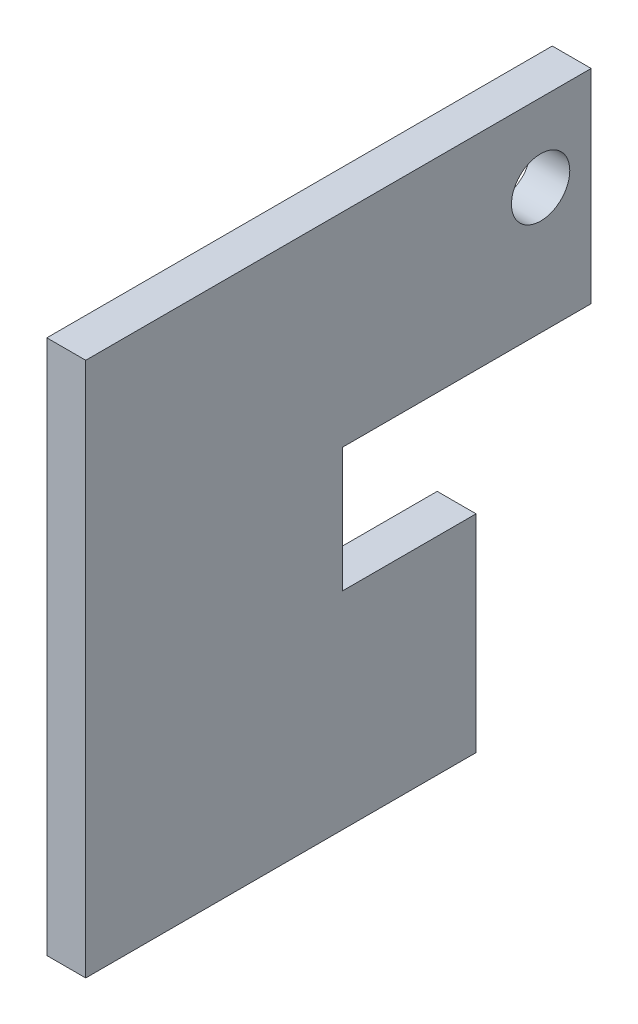
ISO-10303-21;
HEADER;
FILE_DESCRIPTION(('STEP AP214'),'2;1');
FILE_NAME('part.step','',(''),(''),'','','');
FILE_SCHEMA(('AUTOMOTIVE_DESIGN { 1 0 10303 214 1 1 1 1 }'));
ENDSEC;
DATA;
#1=APPLICATION_CONTEXT('core data for automotive mechanical design processes');
#2=APPLICATION_PROTOCOL_DEFINITION('international standard','automotive_design',2000,#1);
#3=PRODUCT_CONTEXT('',#1,'mechanical');
#4=PRODUCT('Part','Part','',(#3));
#5=PRODUCT_RELATED_PRODUCT_CATEGORY('part','',(#4));
#6=PRODUCT_DEFINITION_FORMATION('','',#4);
#7=PRODUCT_DEFINITION_CONTEXT('part definition',#1,'design');
#8=PRODUCT_DEFINITION('design','',#6,#7);
#9=PRODUCT_DEFINITION_SHAPE('','',#8);
#10=(LENGTH_UNIT() NAMED_UNIT(*) SI_UNIT(.MILLI.,.METRE.));
#11=(NAMED_UNIT(*) PLANE_ANGLE_UNIT() SI_UNIT($,.RADIAN.));
#12=(NAMED_UNIT(*) SI_UNIT($,.STERADIAN.) SOLID_ANGLE_UNIT());
#13=UNCERTAINTY_MEASURE_WITH_UNIT(LENGTH_MEASURE(1.E-05),#10,'distance_accuracy_value','');
#14=(GEOMETRIC_REPRESENTATION_CONTEXT(3) GLOBAL_UNCERTAINTY_ASSIGNED_CONTEXT((#13)) GLOBAL_UNIT_ASSIGNED_CONTEXT((#10,
#11,#12)) REPRESENTATION_CONTEXT('',''));
#15=CARTESIAN_POINT('',(0.,0.,0.));
#16=DIRECTION('',(0.,0.,1.));
#17=DIRECTION('',(1.,0.,0.));
#18=AXIS2_PLACEMENT_3D('',#15,#16,#17);
#19=CARTESIAN_POINT('',(1.27,17.4752,0.));
#20=DIRECTION('',(0.,0.,1.));
#21=DIRECTION('',(1.,0.,0.));
#22=AXIS2_PLACEMENT_3D('',#19,#20,#21);
#23=PLANE('',#22);
#24=DIRECTION('',(-1.,0.,0.));
#25=VECTOR('',#24,1.);
#26=CARTESIAN_POINT('',(1.27,10.8204,0.));
#27=LINE('',#26,#25);
#28=CARTESIAN_POINT('',(1.27,10.8204,0.));
#29=VERTEX_POINT('',#28);
#30=CARTESIAN_POINT('',(0.,10.8204,0.));
#31=VERTEX_POINT('',#30);
#32=EDGE_CURVE('E124',#29,#31,#27,.T.);
#33=ORIENTED_EDGE('',*,*,#32,.T.);
#34=DIRECTION('',(0.,1.,0.));
#35=VECTOR('',#34,1.);
#36=CARTESIAN_POINT('',(0.,17.4752,0.));
#37=LINE('',#36,#35);
#38=CARTESIAN_POINT('',(0.,17.4752,0.));
#39=VERTEX_POINT('',#38);
#40=EDGE_CURVE('E162',#31,#39,#37,.T.);
#41=ORIENTED_EDGE('',*,*,#40,.T.);
#42=DIRECTION('',(-1.,0.,0.));
#43=VECTOR('',#42,1.);
#44=CARTESIAN_POINT('',(1.27,17.4752,0.));
#45=LINE('',#44,#43);
#46=CARTESIAN_POINT('',(1.27,17.4752,0.));
#47=VERTEX_POINT('',#46);
#48=EDGE_CURVE('E42',#47,#39,#45,.T.);
#49=ORIENTED_EDGE('',*,*,#48,.F.);
#50=DIRECTION('',(0.,1.,0.));
#51=VECTOR('',#50,1.);
#52=CARTESIAN_POINT('',(1.27,17.4752,0.));
#53=LINE('',#52,#51);
#54=EDGE_CURVE('E152',#29,#47,#53,.T.);
#55=ORIENTED_EDGE('',*,*,#54,.F.);
#56=EDGE_LOOP('',(#33,#41,#49,#55));
#57=FACE_BOUND('',#56,.T.);
#58=ADVANCED_FACE('F34',(#57),#23,.F.);
#59=CARTESIAN_POINT('',(1.27,0.,0.));
#60=DIRECTION('',(1.,0.,0.));
#61=DIRECTION('',(0.,0.,-1.));
#62=AXIS2_PLACEMENT_3D('',#59,#60,#61);
#63=PLANE('',#62);
#64=DIRECTION('',(0.,-1.,0.));
#65=VECTOR('',#64,1.);
#66=CARTESIAN_POINT('',(1.27,10.8204,8.128));
#67=LINE('',#66,#65);
#68=CARTESIAN_POINT('',(1.27,10.8204,8.128));
#69=VERTEX_POINT('',#68);
#70=CARTESIAN_POINT('',(1.27,6.7564,8.128));
#71=VERTEX_POINT('',#70);
#72=EDGE_CURVE('E107',#69,#71,#67,.T.);
#73=ORIENTED_EDGE('',*,*,#72,.F.);
#74=DIRECTION('',(0.,0.,-1.));
#75=VECTOR('',#74,1.);
#76=CARTESIAN_POINT('',(1.27,10.8204,3.7592));
#77=LINE('',#76,#75);
#78=EDGE_CURVE('E137',#69,#29,#77,.T.);
#79=ORIENTED_EDGE('',*,*,#78,.T.);
#80=ORIENTED_EDGE('',*,*,#54,.T.);
#81=DIRECTION('',(0.,0.,1.));
#82=VECTOR('',#81,1.);
#83=CARTESIAN_POINT('',(1.27,17.4752,16.51));
#84=LINE('',#83,#82);
#85=CARTESIAN_POINT('',(1.27,17.4752,16.51));
#86=VERTEX_POINT('',#85);
#87=EDGE_CURVE('E154',#47,#86,#84,.T.);
#88=ORIENTED_EDGE('',*,*,#87,.T.);
#89=DIRECTION('',(0.,-1.,0.));
#90=VECTOR('',#89,1.);
#91=CARTESIAN_POINT('',(1.27,17.4752,16.51));
#92=LINE('',#91,#90);
#93=CARTESIAN_POINT('',(1.27,0.,16.51));
#94=VERTEX_POINT('',#93);
#95=EDGE_CURVE('E146',#86,#94,#92,.T.);
#96=ORIENTED_EDGE('',*,*,#95,.T.);
#97=DIRECTION('',(0.,0.,-1.));
#98=VECTOR('',#97,1.);
#99=CARTESIAN_POINT('',(1.27,0.,16.51));
#100=LINE('',#99,#98);
#101=CARTESIAN_POINT('',(1.27,0.,3.7592));
#102=VERTEX_POINT('',#101);
#103=EDGE_CURVE('E149',#94,#102,#100,.T.);
#104=ORIENTED_EDGE('',*,*,#103,.T.);
#105=DIRECTION('',(0.,1.,0.));
#106=VECTOR('',#105,1.);
#107=CARTESIAN_POINT('',(1.27,0.,3.7592));
#108=LINE('',#107,#106);
#109=CARTESIAN_POINT('',(1.27,6.7564,3.7592));
#110=VERTEX_POINT('',#109);
#111=EDGE_CURVE('E122',#102,#110,#108,.T.);
#112=ORIENTED_EDGE('',*,*,#111,.T.);
#113=DIRECTION('',(0.,0.,-1.));
#114=VECTOR('',#113,1.);
#115=CARTESIAN_POINT('',(1.27,6.7564,8.128));
#116=LINE('',#115,#114);
#117=EDGE_CURVE('E49',#71,#110,#116,.T.);
#118=ORIENTED_EDGE('',*,*,#117,.F.);
#119=EDGE_LOOP('',(#73,#79,#80,#88,#96,#104,#112,#118));
#120=FACE_BOUND('',#119,.T.);
#121=CARTESIAN_POINT('',(1.27,14.9352,1.651));
#122=DIRECTION('',(1.,0.,0.));
#123=DIRECTION('',(0.,0.,-1.));
#124=AXIS2_PLACEMENT_3D('',#121,#122,#123);
#125=CIRCLE('',#124,0.9525);
#126=CARTESIAN_POINT('',(1.27,14.9352,0.6985));
#127=VERTEX_POINT('',#126);
#128=EDGE_CURVE('E139',#127,#127,#125,.T.);
#129=ORIENTED_EDGE('',*,*,#128,.F.);
#130=EDGE_LOOP('',(#129));
#131=FACE_BOUND('',#130,.T.);
#132=ADVANCED_FACE('F119',(#120,#131),#63,.T.);
#133=CARTESIAN_POINT('',(0.,0.,0.));
#134=DIRECTION('',(1.,0.,0.));
#135=DIRECTION('',(0.,0.,-1.));
#136=AXIS2_PLACEMENT_3D('',#133,#134,#135);
#137=PLANE('',#136);
#138=DIRECTION('',(0.,0.,-1.));
#139=VECTOR('',#138,1.);
#140=CARTESIAN_POINT('',(0.,10.8204,3.7592));
#141=LINE('',#140,#139);
#142=CARTESIAN_POINT('',(0.,10.8204,8.128));
#143=VERTEX_POINT('',#142);
#144=EDGE_CURVE('E133',#143,#31,#141,.T.);
#145=ORIENTED_EDGE('',*,*,#144,.F.);
#146=DIRECTION('',(0.,1.,0.));
#147=VECTOR('',#146,1.);
#148=CARTESIAN_POINT('',(0.,10.8204,8.128));
#149=LINE('',#148,#147);
#150=CARTESIAN_POINT('',(0.,6.7564,8.128));
#151=VERTEX_POINT('',#150);
#152=EDGE_CURVE('E106',#151,#143,#149,.T.);
#153=ORIENTED_EDGE('',*,*,#152,.F.);
#154=DIRECTION('',(0.,0.,-1.));
#155=VECTOR('',#154,1.);
#156=CARTESIAN_POINT('',(0.,6.7564,8.128));
#157=LINE('',#156,#155);
#158=CARTESIAN_POINT('',(0.,6.7564,3.7592));
#159=VERTEX_POINT('',#158);
#160=EDGE_CURVE('E102',#151,#159,#157,.T.);
#161=ORIENTED_EDGE('',*,*,#160,.T.);
#162=DIRECTION('',(0.,1.,0.));
#163=VECTOR('',#162,1.);
#164=CARTESIAN_POINT('',(0.,0.,3.7592));
#165=LINE('',#164,#163);
#166=CARTESIAN_POINT('',(0.,0.,3.7592));
#167=VERTEX_POINT('',#166);
#168=EDGE_CURVE('E130',#167,#159,#165,.T.);
#169=ORIENTED_EDGE('',*,*,#168,.F.);
#170=DIRECTION('',(0.,0.,-1.));
#171=VECTOR('',#170,1.);
#172=CARTESIAN_POINT('',(0.,0.,16.51));
#173=LINE('',#172,#171);
#174=CARTESIAN_POINT('',(0.,0.,16.51));
#175=VERTEX_POINT('',#174);
#176=EDGE_CURVE('E159',#175,#167,#173,.T.);
#177=ORIENTED_EDGE('',*,*,#176,.F.);
#178=DIRECTION('',(0.,-1.,0.));
#179=VECTOR('',#178,1.);
#180=CARTESIAN_POINT('',(0.,17.4752,16.51));
#181=LINE('',#180,#179);
#182=CARTESIAN_POINT('',(0.,17.4752,16.51));
#183=VERTEX_POINT('',#182);
#184=EDGE_CURVE('E143',#183,#175,#181,.T.);
#185=ORIENTED_EDGE('',*,*,#184,.F.);
#186=DIRECTION('',(0.,0.,1.));
#187=VECTOR('',#186,1.);
#188=CARTESIAN_POINT('',(0.,17.4752,16.51));
#189=LINE('',#188,#187);
#190=EDGE_CURVE('E150',#39,#183,#189,.T.);
#191=ORIENTED_EDGE('',*,*,#190,.F.);
#192=ORIENTED_EDGE('',*,*,#40,.F.);
#193=EDGE_LOOP('',(#145,#153,#161,#169,#177,#185,#191,#192));
#194=FACE_BOUND('',#193,.T.);
#195=CARTESIAN_POINT('',(0.,14.9352,1.651));
#196=DIRECTION('',(1.,0.,0.));
#197=DIRECTION('',(0.,0.,-1.));
#198=AXIS2_PLACEMENT_3D('',#195,#196,#197);
#199=CIRCLE('',#198,0.9525);
#200=CARTESIAN_POINT('',(0.,14.9352,0.6985));
#201=VERTEX_POINT('',#200);
#202=EDGE_CURVE('E140',#201,#201,#199,.T.);
#203=ORIENTED_EDGE('',*,*,#202,.T.);
#204=EDGE_LOOP('',(#203));
#205=FACE_BOUND('',#204,.T.);
#206=ADVANCED_FACE('F178',(#194,#205),#137,.F.);
#207=CARTESIAN_POINT('',(1.27,17.4752,16.51));
#208=DIRECTION('',(0.,0.,-1.));
#209=DIRECTION('',(0.,1.,0.));
#210=AXIS2_PLACEMENT_3D('',#207,#208,#209);
#211=PLANE('',#210);
#212=ORIENTED_EDGE('',*,*,#184,.T.);
#213=DIRECTION('',(-1.,0.,0.));
#214=VECTOR('',#213,1.);
#215=CARTESIAN_POINT('',(1.27,0.,16.51));
#216=LINE('',#215,#214);
#217=EDGE_CURVE('E11',#94,#175,#216,.T.);
#218=ORIENTED_EDGE('',*,*,#217,.F.);
#219=ORIENTED_EDGE('',*,*,#95,.F.);
#220=DIRECTION('',(-1.,0.,0.));
#221=VECTOR('',#220,1.);
#222=CARTESIAN_POINT('',(1.27,17.4752,16.51));
#223=LINE('',#222,#221);
#224=EDGE_CURVE('E156',#86,#183,#223,.T.);
#225=ORIENTED_EDGE('',*,*,#224,.T.);
#226=EDGE_LOOP('',(#212,#218,#219,#225));
#227=FACE_BOUND('',#226,.T.);
#228=ADVANCED_FACE('F36',(#227),#211,.F.);
#229=CARTESIAN_POINT('',(1.27,0.,16.51));
#230=DIRECTION('',(0.,1.,0.));
#231=DIRECTION('',(0.,0.,1.));
#232=AXIS2_PLACEMENT_3D('',#229,#230,#231);
#233=PLANE('',#232);
#234=ORIENTED_EDGE('',*,*,#176,.T.);
#235=DIRECTION('',(-1.,0.,0.));
#236=VECTOR('',#235,1.);
#237=CARTESIAN_POINT('',(1.27,0.,3.7592));
#238=LINE('',#237,#236);
#239=EDGE_CURVE('E57',#102,#167,#238,.T.);
#240=ORIENTED_EDGE('',*,*,#239,.F.);
#241=ORIENTED_EDGE('',*,*,#103,.F.);
#242=ORIENTED_EDGE('',*,*,#217,.T.);
#243=EDGE_LOOP('',(#234,#240,#241,#242));
#244=FACE_BOUND('',#243,.T.);
#245=ADVANCED_FACE('F206',(#244),#233,.F.);
#246=CARTESIAN_POINT('',(1.27,17.4752,16.51));
#247=DIRECTION('',(0.,-1.,0.));
#248=DIRECTION('',(0.,0.,-1.));
#249=AXIS2_PLACEMENT_3D('',#246,#247,#248);
#250=PLANE('',#249);
#251=ORIENTED_EDGE('',*,*,#190,.T.);
#252=ORIENTED_EDGE('',*,*,#224,.F.);
#253=ORIENTED_EDGE('',*,*,#87,.F.);
#254=ORIENTED_EDGE('',*,*,#48,.T.);
#255=EDGE_LOOP('',(#251,#252,#253,#254));
#256=FACE_BOUND('',#255,.T.);
#257=ADVANCED_FACE('F171',(#256),#250,.F.);
#258=CARTESIAN_POINT('',(0.,14.9352,1.651));
#259=DIRECTION('',(1.,0.,0.));
#260=DIRECTION('',(0.,0.,-1.));
#261=AXIS2_PLACEMENT_3D('',#258,#259,#260);
#262=CYLINDRICAL_SURFACE('',#261,0.9525);
#263=ORIENTED_EDGE('',*,*,#202,.F.);
#264=EDGE_LOOP('',(#263));
#265=FACE_BOUND('',#264,.T.);
#266=ORIENTED_EDGE('',*,*,#128,.T.);
#267=EDGE_LOOP('',(#266));
#268=FACE_BOUND('',#267,.T.);
#269=ADVANCED_FACE('F194',(#265,#268),#262,.F.);
#270=CARTESIAN_POINT('',(1.27,10.8204,3.7592));
#271=DIRECTION('',(0.,-1.,0.));
#272=DIRECTION('',(0.,0.,-1.));
#273=AXIS2_PLACEMENT_3D('',#270,#271,#272);
#274=PLANE('',#273);
#275=ORIENTED_EDGE('',*,*,#32,.F.);
#276=ORIENTED_EDGE('',*,*,#78,.F.);
#277=DIRECTION('',(1.,0.,0.));
#278=VECTOR('',#277,1.);
#279=CARTESIAN_POINT('',(1.27,10.8204,8.128));
#280=LINE('',#279,#278);
#281=EDGE_CURVE('E113',#143,#69,#280,.T.);
#282=ORIENTED_EDGE('',*,*,#281,.F.);
#283=ORIENTED_EDGE('',*,*,#144,.T.);
#284=EDGE_LOOP('',(#275,#276,#282,#283));
#285=FACE_BOUND('',#284,.T.);
#286=ADVANCED_FACE('F184',(#285),#274,.T.);
#287=CARTESIAN_POINT('',(0.,0.,3.7592));
#288=DIRECTION('',(0.,0.,1.));
#289=DIRECTION('',(1.,0.,0.));
#290=AXIS2_PLACEMENT_3D('',#287,#288,#289);
#291=PLANE('',#290);
#292=ORIENTED_EDGE('',*,*,#168,.T.);
#293=DIRECTION('',(-1.,0.,0.));
#294=VECTOR('',#293,1.);
#295=CARTESIAN_POINT('',(1.27,6.7564,3.7592));
#296=LINE('',#295,#294);
#297=EDGE_CURVE('E116',#110,#159,#296,.T.);
#298=ORIENTED_EDGE('',*,*,#297,.F.);
#299=ORIENTED_EDGE('',*,*,#111,.F.);
#300=ORIENTED_EDGE('',*,*,#239,.T.);
#301=EDGE_LOOP('',(#292,#298,#299,#300));
#302=FACE_BOUND('',#301,.T.);
#303=ADVANCED_FACE('F186',(#302),#291,.F.);
#304=CARTESIAN_POINT('',(1.27,6.7564,8.128));
#305=DIRECTION('',(0.,-1.,0.));
#306=DIRECTION('',(0.,0.,-1.));
#307=AXIS2_PLACEMENT_3D('',#304,#305,#306);
#308=PLANE('',#307);
#309=ORIENTED_EDGE('',*,*,#297,.T.);
#310=ORIENTED_EDGE('',*,*,#160,.F.);
#311=DIRECTION('',(-1.,0.,0.));
#312=VECTOR('',#311,1.);
#313=CARTESIAN_POINT('',(1.27,6.7564,8.128));
#314=LINE('',#313,#312);
#315=EDGE_CURVE('E98',#71,#151,#314,.T.);
#316=ORIENTED_EDGE('',*,*,#315,.F.);
#317=ORIENTED_EDGE('',*,*,#117,.T.);
#318=EDGE_LOOP('',(#309,#310,#316,#317));
#319=FACE_BOUND('',#318,.T.);
#320=ADVANCED_FACE('F100',(#319),#308,.F.);
#321=CARTESIAN_POINT('',(0.,0.,8.128));
#322=DIRECTION('',(0.,0.,-1.));
#323=DIRECTION('',(-1.,0.,0.));
#324=AXIS2_PLACEMENT_3D('',#321,#322,#323);
#325=PLANE('',#324);
#326=ORIENTED_EDGE('',*,*,#72,.T.);
#327=ORIENTED_EDGE('',*,*,#315,.T.);
#328=ORIENTED_EDGE('',*,*,#152,.T.);
#329=ORIENTED_EDGE('',*,*,#281,.T.);
#330=EDGE_LOOP('',(#326,#327,#328,#329));
#331=FACE_BOUND('',#330,.T.);
#332=ADVANCED_FACE('F111',(#331),#325,.T.);
#333=CLOSED_SHELL('',(#58,#132,#206,#228,#245,#257,#269,#286,#303,#320,#332));
#334=MANIFOLD_SOLID_BREP('B2',#333);
#335=ADVANCED_BREP_SHAPE_REPRESENTATION('',(#18,#334),#14);
#336=SHAPE_DEFINITION_REPRESENTATION(#9,#335);
ENDSEC;
END-ISO-10303-21;
